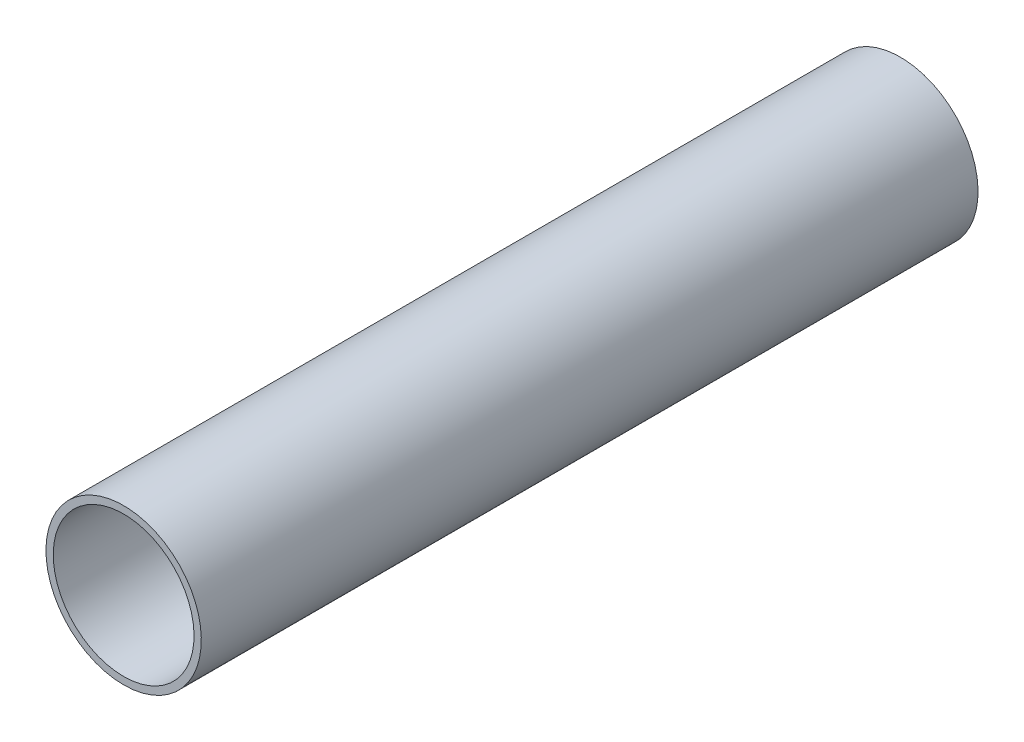
ISO-10303-21;
HEADER;
FILE_DESCRIPTION(('STEP AP214'),'2;1');
FILE_NAME('part.step','',(''),(''),'','','');
FILE_SCHEMA(('AUTOMOTIVE_DESIGN { 1 0 10303 214 1 1 1 1 }'));
ENDSEC;
DATA;
#1=APPLICATION_CONTEXT('core data for automotive mechanical design processes');
#2=APPLICATION_PROTOCOL_DEFINITION('international standard','automotive_design',2000,#1);
#3=PRODUCT_CONTEXT('',#1,'mechanical');
#4=PRODUCT('Part','Part','',(#3));
#5=PRODUCT_RELATED_PRODUCT_CATEGORY('part','',(#4));
#6=PRODUCT_DEFINITION_FORMATION('','',#4);
#7=PRODUCT_DEFINITION_CONTEXT('part definition',#1,'design');
#8=PRODUCT_DEFINITION('design','',#6,#7);
#9=PRODUCT_DEFINITION_SHAPE('','',#8);
#10=(LENGTH_UNIT() NAMED_UNIT(*) SI_UNIT(.MILLI.,.METRE.));
#11=(NAMED_UNIT(*) PLANE_ANGLE_UNIT() SI_UNIT($,.RADIAN.));
#12=(NAMED_UNIT(*) SI_UNIT($,.STERADIAN.) SOLID_ANGLE_UNIT());
#13=UNCERTAINTY_MEASURE_WITH_UNIT(LENGTH_MEASURE(1.E-05),#10,'distance_accuracy_value','');
#14=(GEOMETRIC_REPRESENTATION_CONTEXT(3) GLOBAL_UNCERTAINTY_ASSIGNED_CONTEXT((#13)) GLOBAL_UNIT_ASSIGNED_CONTEXT((#10,
#11,#12)) REPRESENTATION_CONTEXT('',''));
#15=CARTESIAN_POINT('',(0.,0.,0.));
#16=DIRECTION('',(0.,0.,1.));
#17=DIRECTION('',(1.,0.,0.));
#18=AXIS2_PLACEMENT_3D('',#15,#16,#17);
#19=CARTESIAN_POINT('',(0.,7.25000000000002,-40.));
#20=DIRECTION('',(0.,0.,1.));
#21=DIRECTION('',(0.,-1.,0.));
#22=AXIS2_PLACEMENT_3D('',#19,#20,#21);
#23=PLANE('',#22);
#24=CARTESIAN_POINT('',(0.,0.,-40.));
#25=DIRECTION('',(0.,0.,1.));
#26=DIRECTION('',(0.,-1.,0.));
#27=AXIS2_PLACEMENT_3D('',#24,#25,#26);
#28=CIRCLE('',#27,7.99999999999999);
#29=CARTESIAN_POINT('',(0.,-7.99999999999997,-40.));
#30=VERTEX_POINT('',#29);
#31=EDGE_CURVE('E10',#30,#30,#28,.T.);
#32=ORIENTED_EDGE('',*,*,#31,.F.);
#33=EDGE_LOOP('',(#32));
#34=FACE_BOUND('',#33,.T.);
#35=CARTESIAN_POINT('',(0.,0.,-40.));
#36=DIRECTION('',(0.,0.,1.));
#37=DIRECTION('',(0.,-1.,0.));
#38=AXIS2_PLACEMENT_3D('',#35,#36,#37);
#39=CIRCLE('',#38,7.25);
#40=CARTESIAN_POINT('',(0.,-7.24999999999999,-40.));
#41=VERTEX_POINT('',#40);
#42=EDGE_CURVE('E45',#41,#41,#39,.T.);
#43=ORIENTED_EDGE('',*,*,#42,.T.);
#44=EDGE_LOOP('',(#43));
#45=FACE_BOUND('',#44,.T.);
#46=ADVANCED_FACE('F31',(#34,#45),#23,.F.);
#47=CARTESIAN_POINT('',(0.,0.,40.));
#48=DIRECTION('',(0.,0.,1.));
#49=DIRECTION('',(0.,-1.,0.));
#50=AXIS2_PLACEMENT_3D('',#47,#48,#49);
#51=CYLINDRICAL_SURFACE('',#50,7.99999999999999);
#52=CARTESIAN_POINT('',(0.,0.,40.));
#53=DIRECTION('',(0.,0.,1.));
#54=DIRECTION('',(0.,-1.,0.));
#55=AXIS2_PLACEMENT_3D('',#52,#53,#54);
#56=CIRCLE('',#55,7.99999999999999);
#57=CARTESIAN_POINT('',(0.,-7.99999999999999,40.));
#58=VERTEX_POINT('',#57);
#59=EDGE_CURVE('E37',#58,#58,#56,.T.);
#60=ORIENTED_EDGE('',*,*,#59,.F.);
#61=EDGE_LOOP('',(#60));
#62=FACE_BOUND('',#61,.T.);
#63=ORIENTED_EDGE('',*,*,#31,.T.);
#64=EDGE_LOOP('',(#63));
#65=FACE_BOUND('',#64,.T.);
#66=ADVANCED_FACE('F60',(#62,#65),#51,.T.);
#67=CARTESIAN_POINT('',(0.,7.99999999999999,40.));
#68=DIRECTION('',(0.,0.,-1.));
#69=DIRECTION('',(0.,1.,0.));
#70=AXIS2_PLACEMENT_3D('',#67,#68,#69);
#71=PLANE('',#70);
#72=CARTESIAN_POINT('',(0.,0.,40.));
#73=DIRECTION('',(0.,0.,1.));
#74=DIRECTION('',(0.,-1.,0.));
#75=AXIS2_PLACEMENT_3D('',#72,#73,#74);
#76=CIRCLE('',#75,7.25);
#77=CARTESIAN_POINT('',(0.,-7.25,40.));
#78=VERTEX_POINT('',#77);
#79=EDGE_CURVE('E41',#78,#78,#76,.T.);
#80=ORIENTED_EDGE('',*,*,#79,.F.);
#81=EDGE_LOOP('',(#80));
#82=FACE_BOUND('',#81,.T.);
#83=ORIENTED_EDGE('',*,*,#59,.T.);
#84=EDGE_LOOP('',(#83));
#85=FACE_BOUND('',#84,.T.);
#86=ADVANCED_FACE('F55',(#82,#85),#71,.F.);
#87=CARTESIAN_POINT('',(0.,0.,40.));
#88=DIRECTION('',(0.,0.,1.));
#89=DIRECTION('',(0.,-1.,0.));
#90=AXIS2_PLACEMENT_3D('',#87,#88,#89);
#91=CYLINDRICAL_SURFACE('',#90,7.25);
#92=ORIENTED_EDGE('',*,*,#42,.F.);
#93=EDGE_LOOP('',(#92));
#94=FACE_BOUND('',#93,.T.);
#95=ORIENTED_EDGE('',*,*,#79,.T.);
#96=EDGE_LOOP('',(#95));
#97=FACE_BOUND('',#96,.T.);
#98=ADVANCED_FACE('F52',(#94,#97),#91,.F.);
#99=CLOSED_SHELL('',(#46,#66,#86,#98));
#100=MANIFOLD_SOLID_BREP('B2',#99);
#101=ADVANCED_BREP_SHAPE_REPRESENTATION('',(#18,#100),#14);
#102=SHAPE_DEFINITION_REPRESENTATION(#9,#101);
ENDSEC;
END-ISO-10303-21;
